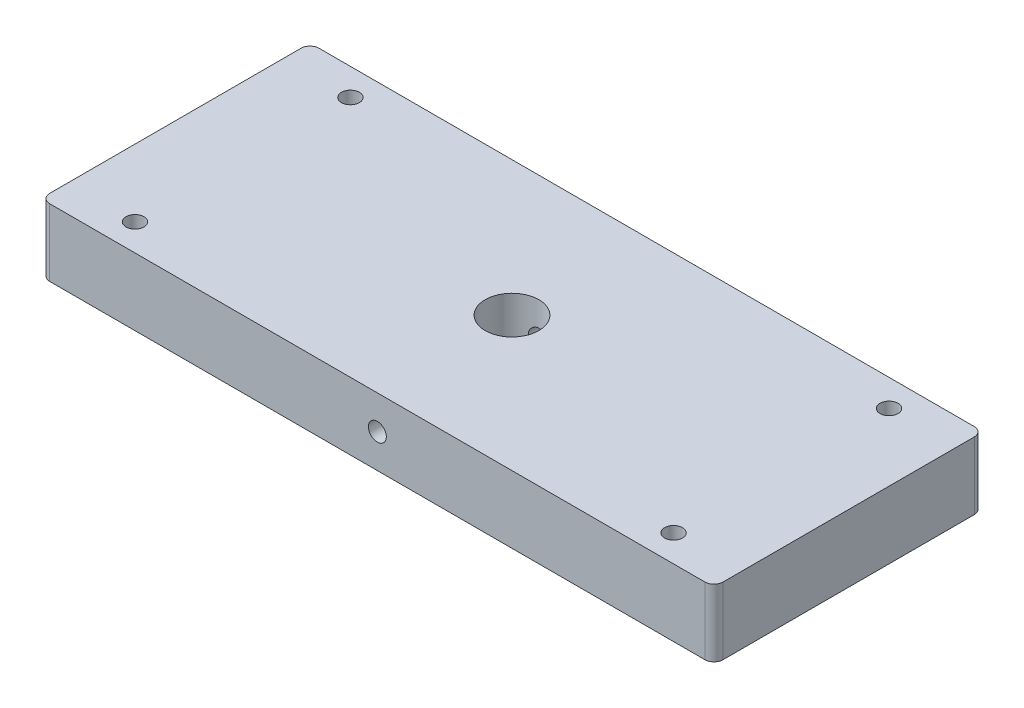
ISO-10303-21;
HEADER;
FILE_DESCRIPTION(('STEP AP214'),'2;1');
FILE_NAME('part.step','',(''),(''),'','','');
FILE_SCHEMA(('AUTOMOTIVE_DESIGN { 1 0 10303 214 1 1 1 1 }'));
ENDSEC;
DATA;
#1=APPLICATION_CONTEXT('core data for automotive mechanical design processes');
#2=APPLICATION_PROTOCOL_DEFINITION('international standard','automotive_design',2000,#1);
#3=PRODUCT_CONTEXT('',#1,'mechanical');
#4=PRODUCT('Part','Part','',(#3));
#5=PRODUCT_RELATED_PRODUCT_CATEGORY('part','',(#4));
#6=PRODUCT_DEFINITION_FORMATION('','',#4);
#7=PRODUCT_DEFINITION_CONTEXT('part definition',#1,'design');
#8=PRODUCT_DEFINITION('design','',#6,#7);
#9=PRODUCT_DEFINITION_SHAPE('','',#8);
#10=(LENGTH_UNIT() NAMED_UNIT(*) SI_UNIT(.MILLI.,.METRE.));
#11=(NAMED_UNIT(*) PLANE_ANGLE_UNIT() SI_UNIT($,.RADIAN.));
#12=(NAMED_UNIT(*) SI_UNIT($,.STERADIAN.) SOLID_ANGLE_UNIT());
#13=UNCERTAINTY_MEASURE_WITH_UNIT(LENGTH_MEASURE(1.E-05),#10,'distance_accuracy_value','');
#14=(GEOMETRIC_REPRESENTATION_CONTEXT(3) GLOBAL_UNCERTAINTY_ASSIGNED_CONTEXT((#13)) GLOBAL_UNIT_ASSIGNED_CONTEXT((#10,
#11,#12)) REPRESENTATION_CONTEXT('',''));
#15=CARTESIAN_POINT('',(0.,0.,0.));
#16=DIRECTION('',(0.,0.,1.));
#17=DIRECTION('',(1.,0.,0.));
#18=AXIS2_PLACEMENT_3D('',#15,#16,#17);
#19=CARTESIAN_POINT('',(73.,7.5,-28.));
#20=DIRECTION('',(0.,-1.,0.));
#21=DIRECTION('',(0.,0.,-1.));
#22=AXIS2_PLACEMENT_3D('',#19,#20,#21);
#23=PLANE('',#22);
#24=CARTESIAN_POINT('',(73.,7.5,-28.));
#25=DIRECTION('',(0.,1.,0.));
#26=DIRECTION('',(0.,0.,-1.));
#27=AXIS2_PLACEMENT_3D('',#24,#25,#26);
#28=CIRCLE('',#27,2.);
#29=CARTESIAN_POINT('',(75.,7.5,-28.));
#30=VERTEX_POINT('',#29);
#31=CARTESIAN_POINT('',(73.,7.5,-30.));
#32=VERTEX_POINT('',#31);
#33=EDGE_CURVE('E171',#30,#32,#28,.T.);
#34=ORIENTED_EDGE('',*,*,#33,.T.);
#35=DIRECTION('',(-1.,0.,0.));
#36=VECTOR('',#35,1.);
#37=CARTESIAN_POINT('',(-73.,7.5,-30.));
#38=LINE('',#37,#36);
#39=CARTESIAN_POINT('',(-73.,7.5,-30.));
#40=VERTEX_POINT('',#39);
#41=EDGE_CURVE('E107',#32,#40,#38,.T.);
#42=ORIENTED_EDGE('',*,*,#41,.T.);
#43=CARTESIAN_POINT('',(-73.,7.5,-28.));
#44=DIRECTION('',(0.,1.,0.));
#45=DIRECTION('',(0.,0.,1.));
#46=AXIS2_PLACEMENT_3D('',#43,#44,#45);
#47=CIRCLE('',#46,2.);
#48=CARTESIAN_POINT('',(-75.,7.5,-28.));
#49=VERTEX_POINT('',#48);
#50=EDGE_CURVE('E268',#40,#49,#47,.T.);
#51=ORIENTED_EDGE('',*,*,#50,.T.);
#52=DIRECTION('',(0.,0.,1.));
#53=VECTOR('',#52,1.);
#54=CARTESIAN_POINT('',(-75.,7.5,-28.));
#55=LINE('',#54,#53);
#56=CARTESIAN_POINT('',(-75.,7.5,28.));
#57=VERTEX_POINT('',#56);
#58=EDGE_CURVE('E275',#49,#57,#55,.T.);
#59=ORIENTED_EDGE('',*,*,#58,.T.);
#60=CARTESIAN_POINT('',(-73.,7.5,28.));
#61=DIRECTION('',(0.,1.,0.));
#62=DIRECTION('',(0.,0.,1.));
#63=AXIS2_PLACEMENT_3D('',#60,#61,#62);
#64=CIRCLE('',#63,2.);
#65=CARTESIAN_POINT('',(-73.,7.5,30.));
#66=VERTEX_POINT('',#65);
#67=EDGE_CURVE('E126',#57,#66,#64,.T.);
#68=ORIENTED_EDGE('',*,*,#67,.T.);
#69=DIRECTION('',(1.,0.,0.));
#70=VECTOR('',#69,1.);
#71=CARTESIAN_POINT('',(-73.,7.5,30.));
#72=LINE('',#71,#70);
#73=CARTESIAN_POINT('',(73.,7.5,30.));
#74=VERTEX_POINT('',#73);
#75=EDGE_CURVE('E120',#66,#74,#72,.T.);
#76=ORIENTED_EDGE('',*,*,#75,.T.);
#77=CARTESIAN_POINT('',(73.,7.5,28.));
#78=DIRECTION('',(0.,1.,0.));
#79=DIRECTION('',(0.,0.,1.));
#80=AXIS2_PLACEMENT_3D('',#77,#78,#79);
#81=CIRCLE('',#80,2.00000000000001);
#82=CARTESIAN_POINT('',(75.,7.5,28.));
#83=VERTEX_POINT('',#82);
#84=EDGE_CURVE('E124',#74,#83,#81,.T.);
#85=ORIENTED_EDGE('',*,*,#84,.T.);
#86=DIRECTION('',(0.,0.,-1.));
#87=VECTOR('',#86,1.);
#88=CARTESIAN_POINT('',(75.,7.5,-28.));
#89=LINE('',#88,#87);
#90=EDGE_CURVE('E64',#83,#30,#89,.T.);
#91=ORIENTED_EDGE('',*,*,#90,.T.);
#92=EDGE_LOOP('',(#34,#42,#51,#59,#68,#76,#85,#91));
#93=FACE_BOUND('',#92,.T.);
#94=CARTESIAN_POINT('',(0.,7.5,0.));
#95=DIRECTION('',(0.,1.,0.));
#96=DIRECTION('',(0.,0.,1.));
#97=AXIS2_PLACEMENT_3D('',#94,#95,#96);
#98=CIRCLE('',#97,5.975);
#99=CARTESIAN_POINT('',(0.,7.5,5.97500000000001));
#100=VERTEX_POINT('',#99);
#101=EDGE_CURVE('E153',#100,#100,#98,.T.);
#102=ORIENTED_EDGE('',*,*,#101,.F.);
#103=EDGE_LOOP('',(#102));
#104=FACE_BOUND('',#103,.T.);
#105=CARTESIAN_POINT('',(-60.,7.5,-24.));
#106=DIRECTION('',(0.,1.,0.));
#107=DIRECTION('',(0.,0.,1.));
#108=AXIS2_PLACEMENT_3D('',#105,#106,#107);
#109=CIRCLE('',#108,2.);
#110=CARTESIAN_POINT('',(-60.,7.5,-22.));
#111=VERTEX_POINT('',#110);
#112=EDGE_CURVE('E289',#111,#111,#109,.T.);
#113=ORIENTED_EDGE('',*,*,#112,.F.);
#114=EDGE_LOOP('',(#113));
#115=FACE_BOUND('',#114,.T.);
#116=CARTESIAN_POINT('',(-60.,7.5,24.));
#117=DIRECTION('',(0.,1.,0.));
#118=DIRECTION('',(0.,0.,1.));
#119=AXIS2_PLACEMENT_3D('',#116,#117,#118);
#120=CIRCLE('',#119,2.);
#121=CARTESIAN_POINT('',(-60.,7.5,26.));
#122=VERTEX_POINT('',#121);
#123=EDGE_CURVE('E297',#122,#122,#120,.T.);
#124=ORIENTED_EDGE('',*,*,#123,.F.);
#125=EDGE_LOOP('',(#124));
#126=FACE_BOUND('',#125,.T.);
#127=CARTESIAN_POINT('',(60.,7.5,24.));
#128=DIRECTION('',(0.,1.,0.));
#129=DIRECTION('',(0.,0.,1.));
#130=AXIS2_PLACEMENT_3D('',#127,#128,#129);
#131=CIRCLE('',#130,2.);
#132=CARTESIAN_POINT('',(60.,7.5,26.));
#133=VERTEX_POINT('',#132);
#134=EDGE_CURVE('E304',#133,#133,#131,.T.);
#135=ORIENTED_EDGE('',*,*,#134,.F.);
#136=EDGE_LOOP('',(#135));
#137=FACE_BOUND('',#136,.T.);
#138=CARTESIAN_POINT('',(60.,7.5,-24.));
#139=DIRECTION('',(0.,1.,0.));
#140=DIRECTION('',(0.,0.,1.));
#141=AXIS2_PLACEMENT_3D('',#138,#139,#140);
#142=CIRCLE('',#141,2.);
#143=CARTESIAN_POINT('',(60.,7.5,-22.));
#144=VERTEX_POINT('',#143);
#145=EDGE_CURVE('E312',#144,#144,#142,.T.);
#146=ORIENTED_EDGE('',*,*,#145,.F.);
#147=EDGE_LOOP('',(#146));
#148=FACE_BOUND('',#147,.T.);
#149=ADVANCED_FACE('F39',(#93,#104,#115,#126,#137,#148),#23,.F.);
#150=CARTESIAN_POINT('',(73.,-7.5,-28.));
#151=DIRECTION('',(0.,-1.,0.));
#152=DIRECTION('',(0.,0.,-1.));
#153=AXIS2_PLACEMENT_3D('',#150,#151,#152);
#154=PLANE('',#153);
#155=CARTESIAN_POINT('',(60.,-7.5,24.));
#156=DIRECTION('',(0.,1.,0.));
#157=DIRECTION('',(0.,0.,1.));
#158=AXIS2_PLACEMENT_3D('',#155,#156,#157);
#159=CIRCLE('',#158,2.);
#160=CARTESIAN_POINT('',(60.,-7.5,26.));
#161=VERTEX_POINT('',#160);
#162=EDGE_CURVE('E308',#161,#161,#159,.T.);
#163=ORIENTED_EDGE('',*,*,#162,.T.);
#164=EDGE_LOOP('',(#163));
#165=FACE_BOUND('',#164,.T.);
#166=CARTESIAN_POINT('',(-60.,-7.5,-24.));
#167=DIRECTION('',(0.,1.,0.));
#168=DIRECTION('',(0.,0.,1.));
#169=AXIS2_PLACEMENT_3D('',#166,#167,#168);
#170=CIRCLE('',#169,2.);
#171=CARTESIAN_POINT('',(-60.,-7.5,-22.));
#172=VERTEX_POINT('',#171);
#173=EDGE_CURVE('E293',#172,#172,#170,.T.);
#174=ORIENTED_EDGE('',*,*,#173,.T.);
#175=EDGE_LOOP('',(#174));
#176=FACE_BOUND('',#175,.T.);
#177=CARTESIAN_POINT('',(73.,-7.5,-28.));
#178=DIRECTION('',(0.,1.,0.));
#179=DIRECTION('',(0.,0.,-1.));
#180=AXIS2_PLACEMENT_3D('',#177,#178,#179);
#181=CIRCLE('',#180,2.);
#182=CARTESIAN_POINT('',(75.,-7.5,-28.));
#183=VERTEX_POINT('',#182);
#184=CARTESIAN_POINT('',(73.,-7.5,-30.));
#185=VERTEX_POINT('',#184);
#186=EDGE_CURVE('E148',#183,#185,#181,.T.);
#187=ORIENTED_EDGE('',*,*,#186,.F.);
#188=DIRECTION('',(0.,0.,-1.));
#189=VECTOR('',#188,1.);
#190=CARTESIAN_POINT('',(75.,-7.5,-28.));
#191=LINE('',#190,#189);
#192=CARTESIAN_POINT('',(75.,-7.5,28.));
#193=VERTEX_POINT('',#192);
#194=EDGE_CURVE('E99',#193,#183,#191,.T.);
#195=ORIENTED_EDGE('',*,*,#194,.F.);
#196=CARTESIAN_POINT('',(73.,-7.5,28.));
#197=DIRECTION('',(0.,1.,0.));
#198=DIRECTION('',(0.,0.,1.));
#199=AXIS2_PLACEMENT_3D('',#196,#197,#198);
#200=CIRCLE('',#199,2.00000000000001);
#201=CARTESIAN_POINT('',(73.,-7.5,30.));
#202=VERTEX_POINT('',#201);
#203=EDGE_CURVE('E93',#202,#193,#200,.T.);
#204=ORIENTED_EDGE('',*,*,#203,.F.);
#205=DIRECTION('',(1.,0.,0.));
#206=VECTOR('',#205,1.);
#207=CARTESIAN_POINT('',(-73.,-7.5,30.));
#208=LINE('',#207,#206);
#209=CARTESIAN_POINT('',(-73.,-7.5,30.));
#210=VERTEX_POINT('',#209);
#211=EDGE_CURVE('E135',#210,#202,#208,.T.);
#212=ORIENTED_EDGE('',*,*,#211,.F.);
#213=CARTESIAN_POINT('',(-73.,-7.5,28.));
#214=DIRECTION('',(0.,1.,0.));
#215=DIRECTION('',(0.,0.,1.));
#216=AXIS2_PLACEMENT_3D('',#213,#214,#215);
#217=CIRCLE('',#216,2.);
#218=CARTESIAN_POINT('',(-75.,-7.5,28.));
#219=VERTEX_POINT('',#218);
#220=EDGE_CURVE('E162',#219,#210,#217,.T.);
#221=ORIENTED_EDGE('',*,*,#220,.F.);
#222=DIRECTION('',(0.,0.,1.));
#223=VECTOR('',#222,1.);
#224=CARTESIAN_POINT('',(-75.,-7.5,-28.));
#225=LINE('',#224,#223);
#226=CARTESIAN_POINT('',(-75.,-7.5,-28.));
#227=VERTEX_POINT('',#226);
#228=EDGE_CURVE('E159',#227,#219,#225,.T.);
#229=ORIENTED_EDGE('',*,*,#228,.F.);
#230=CARTESIAN_POINT('',(-73.,-7.5,-28.));
#231=DIRECTION('',(0.,1.,0.));
#232=DIRECTION('',(0.,0.,1.));
#233=AXIS2_PLACEMENT_3D('',#230,#231,#232);
#234=CIRCLE('',#233,2.);
#235=CARTESIAN_POINT('',(-73.,-7.5,-30.));
#236=VERTEX_POINT('',#235);
#237=EDGE_CURVE('E156',#236,#227,#234,.T.);
#238=ORIENTED_EDGE('',*,*,#237,.F.);
#239=DIRECTION('',(-1.,0.,0.));
#240=VECTOR('',#239,1.);
#241=CARTESIAN_POINT('',(-73.,-7.5,-30.));
#242=LINE('',#241,#240);
#243=EDGE_CURVE('E152',#185,#236,#242,.T.);
#244=ORIENTED_EDGE('',*,*,#243,.F.);
#245=EDGE_LOOP('',(#187,#195,#204,#212,#221,#229,#238,#244));
#246=FACE_BOUND('',#245,.T.);
#247=CARTESIAN_POINT('',(0.,-7.5,0.));
#248=DIRECTION('',(0.,1.,0.));
#249=DIRECTION('',(0.,0.,1.));
#250=AXIS2_PLACEMENT_3D('',#247,#248,#249);
#251=CIRCLE('',#250,5.975);
#252=CARTESIAN_POINT('',(0.,-7.5,5.97500000000001));
#253=VERTEX_POINT('',#252);
#254=EDGE_CURVE('E285',#253,#253,#251,.T.);
#255=ORIENTED_EDGE('',*,*,#254,.T.);
#256=EDGE_LOOP('',(#255));
#257=FACE_BOUND('',#256,.T.);
#258=CARTESIAN_POINT('',(-60.,-7.5,24.));
#259=DIRECTION('',(0.,1.,0.));
#260=DIRECTION('',(0.,0.,1.));
#261=AXIS2_PLACEMENT_3D('',#258,#259,#260);
#262=CIRCLE('',#261,2.);
#263=CARTESIAN_POINT('',(-60.,-7.5,26.));
#264=VERTEX_POINT('',#263);
#265=EDGE_CURVE('E300',#264,#264,#262,.T.);
#266=ORIENTED_EDGE('',*,*,#265,.T.);
#267=EDGE_LOOP('',(#266));
#268=FACE_BOUND('',#267,.T.);
#269=CARTESIAN_POINT('',(60.,-7.5,-24.));
#270=DIRECTION('',(0.,1.,0.));
#271=DIRECTION('',(0.,0.,1.));
#272=AXIS2_PLACEMENT_3D('',#269,#270,#271);
#273=CIRCLE('',#272,2.);
#274=CARTESIAN_POINT('',(60.,-7.5,-22.));
#275=VERTEX_POINT('',#274);
#276=EDGE_CURVE('E316',#275,#275,#273,.T.);
#277=ORIENTED_EDGE('',*,*,#276,.T.);
#278=EDGE_LOOP('',(#277));
#279=FACE_BOUND('',#278,.T.);
#280=ADVANCED_FACE('F228',(#165,#176,#246,#257,#268,#279),#154,.T.);
#281=CARTESIAN_POINT('',(73.,7.5,-28.));
#282=DIRECTION('',(0.,-1.,0.));
#283=DIRECTION('',(0.,0.,-1.));
#284=AXIS2_PLACEMENT_3D('',#281,#282,#283);
#285=CYLINDRICAL_SURFACE('',#284,2.);
#286=ORIENTED_EDGE('',*,*,#186,.T.);
#287=DIRECTION('',(0.,-1.,0.));
#288=VECTOR('',#287,1.);
#289=CARTESIAN_POINT('',(73.,7.5,-30.));
#290=LINE('',#289,#288);
#291=EDGE_CURVE('E11',#32,#185,#290,.T.);
#292=ORIENTED_EDGE('',*,*,#291,.F.);
#293=ORIENTED_EDGE('',*,*,#33,.F.);
#294=DIRECTION('',(0.,-1.,0.));
#295=VECTOR('',#294,1.);
#296=CARTESIAN_POINT('',(75.,7.5,-28.));
#297=LINE('',#296,#295);
#298=EDGE_CURVE('E144',#30,#183,#297,.T.);
#299=ORIENTED_EDGE('',*,*,#298,.T.);
#300=EDGE_LOOP('',(#286,#292,#293,#299));
#301=FACE_BOUND('',#300,.T.);
#302=ADVANCED_FACE('F41',(#301),#285,.T.);
#303=CARTESIAN_POINT('',(-73.,7.5,-30.));
#304=DIRECTION('',(0.,0.,1.));
#305=DIRECTION('',(1.,0.,0.));
#306=AXIS2_PLACEMENT_3D('',#303,#304,#305);
#307=PLANE('',#306);
#308=CARTESIAN_POINT('',(0.,0.,-30.));
#309=DIRECTION('',(0.,0.,1.));
#310=DIRECTION('',(1.,0.,0.));
#311=AXIS2_PLACEMENT_3D('',#308,#309,#310);
#312=CIRCLE('',#311,2.);
#313=CARTESIAN_POINT('',(2.,0.,-30.));
#314=VERTEX_POINT('',#313);
#315=EDGE_CURVE('E194',#314,#314,#312,.T.);
#316=ORIENTED_EDGE('',*,*,#315,.T.);
#317=EDGE_LOOP('',(#316));
#318=FACE_BOUND('',#317,.T.);
#319=ORIENTED_EDGE('',*,*,#243,.T.);
#320=DIRECTION('',(0.,-1.,0.));
#321=VECTOR('',#320,1.);
#322=CARTESIAN_POINT('',(-73.,7.5,-30.));
#323=LINE('',#322,#321);
#324=EDGE_CURVE('E55',#40,#236,#323,.T.);
#325=ORIENTED_EDGE('',*,*,#324,.F.);
#326=ORIENTED_EDGE('',*,*,#41,.F.);
#327=ORIENTED_EDGE('',*,*,#291,.T.);
#328=EDGE_LOOP('',(#319,#325,#326,#327));
#329=FACE_BOUND('',#328,.T.);
#330=ADVANCED_FACE('F252',(#318,#329),#307,.F.);
#331=CARTESIAN_POINT('',(-73.,7.5,-28.));
#332=DIRECTION('',(0.,-1.,0.));
#333=DIRECTION('',(0.,0.,-1.));
#334=AXIS2_PLACEMENT_3D('',#331,#332,#333);
#335=CYLINDRICAL_SURFACE('',#334,2.);
#336=ORIENTED_EDGE('',*,*,#237,.T.);
#337=DIRECTION('',(0.,-1.,0.));
#338=VECTOR('',#337,1.);
#339=CARTESIAN_POINT('',(-75.,7.5,-28.));
#340=LINE('',#339,#338);
#341=EDGE_CURVE('E182',#49,#227,#340,.T.);
#342=ORIENTED_EDGE('',*,*,#341,.F.);
#343=ORIENTED_EDGE('',*,*,#50,.F.);
#344=ORIENTED_EDGE('',*,*,#324,.T.);
#345=EDGE_LOOP('',(#336,#342,#343,#344));
#346=FACE_BOUND('',#345,.T.);
#347=ADVANCED_FACE('F249',(#346),#335,.T.);
#348=CARTESIAN_POINT('',(-75.,7.5,-28.));
#349=DIRECTION('',(1.,0.,0.));
#350=DIRECTION('',(0.,0.,-1.));
#351=AXIS2_PLACEMENT_3D('',#348,#349,#350);
#352=PLANE('',#351);
#353=ORIENTED_EDGE('',*,*,#228,.T.);
#354=DIRECTION('',(0.,-1.,0.));
#355=VECTOR('',#354,1.);
#356=CARTESIAN_POINT('',(-75.,7.5,28.));
#357=LINE('',#356,#355);
#358=EDGE_CURVE('E178',#57,#219,#357,.T.);
#359=ORIENTED_EDGE('',*,*,#358,.F.);
#360=ORIENTED_EDGE('',*,*,#58,.F.);
#361=ORIENTED_EDGE('',*,*,#341,.T.);
#362=EDGE_LOOP('',(#353,#359,#360,#361));
#363=FACE_BOUND('',#362,.T.);
#364=ADVANCED_FACE('F245',(#363),#352,.F.);
#365=CARTESIAN_POINT('',(-73.,7.5,28.));
#366=DIRECTION('',(0.,-1.,0.));
#367=DIRECTION('',(0.,0.,-1.));
#368=AXIS2_PLACEMENT_3D('',#365,#366,#367);
#369=CYLINDRICAL_SURFACE('',#368,2.);
#370=ORIENTED_EDGE('',*,*,#220,.T.);
#371=DIRECTION('',(0.,-1.,0.));
#372=VECTOR('',#371,1.);
#373=CARTESIAN_POINT('',(-73.,7.5,30.));
#374=LINE('',#373,#372);
#375=EDGE_CURVE('E137',#66,#210,#374,.T.);
#376=ORIENTED_EDGE('',*,*,#375,.F.);
#377=ORIENTED_EDGE('',*,*,#67,.F.);
#378=ORIENTED_EDGE('',*,*,#358,.T.);
#379=EDGE_LOOP('',(#370,#376,#377,#378));
#380=FACE_BOUND('',#379,.T.);
#381=ADVANCED_FACE('F241',(#380),#369,.T.);
#382=CARTESIAN_POINT('',(-73.,7.5,30.));
#383=DIRECTION('',(0.,0.,-1.));
#384=DIRECTION('',(-1.,0.,0.));
#385=AXIS2_PLACEMENT_3D('',#382,#383,#384);
#386=PLANE('',#385);
#387=CARTESIAN_POINT('',(0.,0.,30.));
#388=DIRECTION('',(0.,0.,1.));
#389=DIRECTION('',(1.,0.,0.));
#390=AXIS2_PLACEMENT_3D('',#387,#388,#389);
#391=CIRCLE('',#390,2.);
#392=CARTESIAN_POINT('',(2.,0.,30.));
#393=VERTEX_POINT('',#392);
#394=EDGE_CURVE('E323',#393,#393,#391,.T.);
#395=ORIENTED_EDGE('',*,*,#394,.F.);
#396=EDGE_LOOP('',(#395));
#397=FACE_BOUND('',#396,.T.);
#398=ORIENTED_EDGE('',*,*,#211,.T.);
#399=DIRECTION('',(0.,-1.,0.));
#400=VECTOR('',#399,1.);
#401=CARTESIAN_POINT('',(73.,7.5,30.));
#402=LINE('',#401,#400);
#403=EDGE_CURVE('E132',#74,#202,#402,.T.);
#404=ORIENTED_EDGE('',*,*,#403,.F.);
#405=ORIENTED_EDGE('',*,*,#75,.F.);
#406=ORIENTED_EDGE('',*,*,#375,.T.);
#407=EDGE_LOOP('',(#398,#404,#405,#406));
#408=FACE_BOUND('',#407,.T.);
#409=ADVANCED_FACE('F133',(#397,#408),#386,.F.);
#410=CARTESIAN_POINT('',(73.,7.5,28.));
#411=DIRECTION('',(0.,-1.,0.));
#412=DIRECTION('',(0.,0.,-1.));
#413=AXIS2_PLACEMENT_3D('',#410,#411,#412);
#414=CYLINDRICAL_SURFACE('',#413,2.00000000000001);
#415=ORIENTED_EDGE('',*,*,#203,.T.);
#416=DIRECTION('',(0.,-1.,0.));
#417=VECTOR('',#416,1.);
#418=CARTESIAN_POINT('',(75.,7.5,28.));
#419=LINE('',#418,#417);
#420=EDGE_CURVE('E138',#83,#193,#419,.T.);
#421=ORIENTED_EDGE('',*,*,#420,.F.);
#422=ORIENTED_EDGE('',*,*,#84,.F.);
#423=ORIENTED_EDGE('',*,*,#403,.T.);
#424=EDGE_LOOP('',(#415,#421,#422,#423));
#425=FACE_BOUND('',#424,.T.);
#426=ADVANCED_FACE('F140',(#425),#414,.T.);
#427=CARTESIAN_POINT('',(75.,7.5,-28.));
#428=DIRECTION('',(-1.,0.,0.));
#429=DIRECTION('',(0.,0.,1.));
#430=AXIS2_PLACEMENT_3D('',#427,#428,#429);
#431=PLANE('',#430);
#432=ORIENTED_EDGE('',*,*,#194,.T.);
#433=ORIENTED_EDGE('',*,*,#298,.F.);
#434=ORIENTED_EDGE('',*,*,#90,.F.);
#435=ORIENTED_EDGE('',*,*,#420,.T.);
#436=EDGE_LOOP('',(#432,#433,#434,#435));
#437=FACE_BOUND('',#436,.T.);
#438=ADVANCED_FACE('F223',(#437),#431,.F.);
#439=CARTESIAN_POINT('',(0.,7.5,0.));
#440=DIRECTION('',(0.,-1.,0.));
#441=DIRECTION('',(0.,0.,-1.));
#442=AXIS2_PLACEMENT_3D('',#439,#440,#441);
#443=CYLINDRICAL_SURFACE('',#442,5.975);
#444=CARTESIAN_POINT('',(0.,2.,-5.97499999999999));
#445=CARTESIAN_POINT('',(-0.109100813274884,2.00000059896354,-5.9750003724338));
#446=CARTESIAN_POINT('',(-0.218197830002885,1.99104375200792,-5.97198429779646));
#447=CARTESIAN_POINT('',(-0.433176897194453,1.95556377412956,-5.96024981686502));
#448=CARTESIAN_POINT('',(-0.539058639529741,1.92903896514381,-5.95153086584249));
#449=CARTESIAN_POINT('',(-0.744476820137431,1.85943523190862,-5.92933765105528));
#450=CARTESIAN_POINT('',(-0.844023593017146,1.8163841193542,-5.91587137952719));
#451=CARTESIAN_POINT('',(-1.03448354716831,1.71507604988111,-5.88555696328018));
#452=CARTESIAN_POINT('',(-1.12539499811192,1.65681605416766,-5.86870814287023));
#453=CARTESIAN_POINT('',(-1.29917545528331,1.5246096551223,-5.83274331063229));
#454=CARTESIAN_POINT('',(-1.38170162434403,1.45022755550802,-5.81357266246458));
#455=CARTESIAN_POINT('',(-1.53337086821341,1.28881467943789,-5.77542437648222));
#456=CARTESIAN_POINT('',(-1.60251096272538,1.20178109376964,-5.75644678253849));
#457=CARTESIAN_POINT('',(-1.72740941752546,1.01444099185338,-5.72023106450879));
#458=CARTESIAN_POINT('',(-1.78272089322697,0.913822440377365,-5.70305945421818));
#459=CARTESIAN_POINT('',(-1.8754902877492,0.704043735076641,-5.67323128414203));
#460=CARTESIAN_POINT('',(-1.91295370707432,0.594886224920731,-5.66057333361683));
#461=CARTESIAN_POINT('',(-1.96767524087776,0.375028398467926,-5.64178126070682));
#462=CARTESIAN_POINT('',(-1.98557616483407,0.264506285702271,-5.63544023758891));
#463=CARTESIAN_POINT('',(-2.00267409096361,0.0418593493393735,-5.62938820727482));
#464=CARTESIAN_POINT('',(-2.00187693044101,-0.0702649631472946,-5.62967513091753));
#465=CARTESIAN_POINT('',(-1.98210017412321,-0.287439036978317,-5.63666535220946));
#466=CARTESIAN_POINT('',(-1.96396106381363,-0.392576543435622,-5.64307204016887));
#467=CARTESIAN_POINT('',(-1.9113870101616,-0.598219755737712,-5.66109433033176));
#468=CARTESIAN_POINT('',(-1.87695010041656,-0.698724901061138,-5.67271056108107));
#469=CARTESIAN_POINT('',(-1.7922106971008,-0.89415365268584,-5.70005335908901));
#470=CARTESIAN_POINT('',(-1.74166017689717,-0.988960436439102,-5.71584347581665));
#471=CARTESIAN_POINT('',(-1.62630069622426,-1.16901073138383,-5.7497284485762));
#472=CARTESIAN_POINT('',(-1.56148758962884,-1.25425145082299,-5.76782397414385));
#473=CARTESIAN_POINT('',(-1.41541220527446,-1.41747062705215,-5.80544614969133));
#474=CARTESIAN_POINT('',(-1.33346331083791,-1.4948300463213,-5.82499797576023));
#475=CARTESIAN_POINT('',(-1.15751546522779,-1.63487037660952,-5.86249639794598));
#476=CARTESIAN_POINT('',(-1.0635153402702,-1.69754985612629,-5.88044283740948));
#477=CARTESIAN_POINT('',(-0.86481201755234,-1.80695506968283,-5.91294744407533));
#478=CARTESIAN_POINT('',(-0.760010510593378,-1.85351367364004,-5.92746964541324));
#479=CARTESIAN_POINT('',(-0.543460315788158,-1.92814784115666,-5.95122825559354));
#480=CARTESIAN_POINT('',(-0.431714077356982,-1.95622988138405,-5.96046651648936));
#481=CARTESIAN_POINT('',(-0.209686115466093,-1.99201412882851,-5.97230893940714));
#482=CARTESIAN_POINT('',(-0.0995535257638037,-2.00055272866229,-5.97518518142562));
#483=CARTESIAN_POINT('',(0.120593534889892,-1.99939193590181,-5.9747962963955));
#484=CARTESIAN_POINT('',(0.230608022771819,-1.98969565101988,-5.97153221582215));
#485=CARTESIAN_POINT('',(0.444039974974208,-1.95300139776784,-5.95940904167567));
#486=CARTESIAN_POINT('',(0.547556278869396,-1.92651790023294,-5.95071642750179));
#487=CARTESIAN_POINT('',(0.748633870501959,-1.85764529627934,-5.92877813667515));
#488=CARTESIAN_POINT('',(0.84619439579197,-1.81525415833895,-5.91553187850698));
#489=CARTESIAN_POINT('',(1.03546517156792,-1.71452843969373,-5.88539452249207));
#490=CARTESIAN_POINT('',(1.12695270718522,-1.65580215849242,-5.86841636023654));
#491=CARTESIAN_POINT('',(1.29904600477758,-1.52453276944969,-5.83273872197785));
#492=CARTESIAN_POINT('',(1.37964840568976,-1.45198541059164,-5.8140387172959));
#493=CARTESIAN_POINT('',(1.53152918940361,-1.2912005581871,-5.77593790002973));
#494=CARTESIAN_POINT('',(1.60221081616876,-1.20239628776467,-5.75654425518448));
#495=CARTESIAN_POINT('',(1.72774387684645,-1.01377196903023,-5.7201234555775));
#496=CARTESIAN_POINT('',(1.78259514759318,-0.913951807190477,-5.70309632520871));
#497=CARTESIAN_POINT('',(1.87466369293018,-0.7060660448288,-5.67350060566454));
#498=CARTESIAN_POINT('',(1.91191397217894,-0.598016321593866,-5.66092368285891));
#499=CARTESIAN_POINT('',(1.9675200829789,-0.376658713141155,-5.64184108492867));
#500=CARTESIAN_POINT('',(1.98588452107118,-0.263353247663529,-5.6353326444384));
#501=CARTESIAN_POINT('',(2.00252302665274,-0.0410146814933406,-5.62944014042115));
#502=CARTESIAN_POINT('',(2.00178841621071,0.0679357359795869,-5.62970452728682));
#503=CARTESIAN_POINT('',(1.98269261147232,0.284074122170127,-5.63645768263715));
#504=CARTESIAN_POINT('',(1.9643324831172,0.391262197070483,-5.64294607471165));
#505=CARTESIAN_POINT('',(1.91121096958018,0.598771658265601,-5.66115334875372));
#506=CARTESIAN_POINT('',(1.8767732269619,0.699185686507176,-5.67276878232819));
#507=CARTESIAN_POINT('',(1.79273692668093,0.892886935908095,-5.69988241407682));
#508=CARTESIAN_POINT('',(1.74313498609759,0.986172561010127,-5.71538147849544));
#509=CARTESIAN_POINT('',(1.62763571684274,1.16741194089794,-5.74936494922369));
#510=CARTESIAN_POINT('',(1.56111817519713,1.25495134845545,-5.76795060177786));
#511=CARTESIAN_POINT('',(1.41472153581611,1.41794558508448,-5.80559155306819));
#512=CARTESIAN_POINT('',(1.33483864550896,1.49339697211084,-5.82464698379696));
#513=CARTESIAN_POINT('',(1.16019751810557,1.63307273341956,-5.86198235860112));
#514=CARTESIAN_POINT('',(1.06497698067349,1.69673719788853,-5.88020210955702));
#515=CARTESIAN_POINT('',(0.864584412586536,1.80708825919812,-5.91298629909343));
#516=CARTESIAN_POINT('',(0.75941483616462,1.85377902942496,-5.92755163592525));
#517=CARTESIAN_POINT('',(0.546636434984586,1.926995145888,-5.95086372208996));
#518=CARTESIAN_POINT('',(0.439314612899803,1.95428368569864,-5.95982876513122));
#519=CARTESIAN_POINT('',(0.22132659047178,1.99078325984075,-5.97189588846116));
#520=CARTESIAN_POINT('',(0.110661342269977,1.99999939246915,-5.97499962223905));
#521=CARTESIAN_POINT('',(0.,2.,-5.97499999999999));
#522=B_SPLINE_CURVE_WITH_KNOTS('',3,(#444,#445,#446,#447,#448,#449,#450,#451,#452,#453,#454,
#455,#456,#457,#458,#459,#460,#461,#462,#463,#464,#465,#466,#467,#468,#469,#470,#471,#472,#473,
#474,#475,#476,#477,#478,#479,#480,#481,#482,#483,#484,#485,#486,#487,#488,#489,#490,#491,#492,
#493,#494,#495,#496,#497,#498,#499,#500,#501,#502,#503,#504,#505,#506,#507,#508,#509,#510,#511,
#512,#513,#514,#515,#516,#517,#518,#519,#520,#521),.UNSPECIFIED.,.T.,.F.,(4,2,2,2,2,2,2,2,2,2,2,
2,2,2,2,2,2,2,2,2,2,2,2,2,2,2,2,2,2,2,2,2,2,2,2,2,2,2,4),(0.,0.326895182167216,
0.653821593331832,0.980200223348177,1.30664411507914,1.64335422921556,1.98013922303025,
2.3267039050189,2.67316171174657,3.00785688734735,3.34244757676215,3.6616029853937,
3.98079691137723,4.30516268348809,4.62962287341017,4.97117368809431,5.31275779497208,
5.65778403186826,6.00268926073309,6.33253325369512,6.66232103750845,6.98246066800652,
7.30264119659158,7.63128240058703,7.96002485004134,8.30383631778335,8.64765132911415,
8.99081904865289,9.33383031248494,9.65907515692264,9.98430033271534,10.303243733124,
10.6222583373327,10.955289407857,11.2884151405611,11.6346745188574,11.9808487033812,
12.3125132246329,12.6440841685548),.UNSPECIFIED.);
#523=CARTESIAN_POINT('',(0.,2.,-5.97499999999999));
#524=VERTEX_POINT('',#523);
#525=EDGE_CURVE('E43',#524,#524,#522,.T.);
#526=ORIENTED_EDGE('',*,*,#525,.F.);
#527=EDGE_LOOP('',(#526));
#528=FACE_BOUND('',#527,.T.);
#529=CARTESIAN_POINT('',(2.,0.,5.63033080733274));
#530=CARTESIAN_POINT('',(2.00000061060343,-0.108907263927318,5.63033036561841));
#531=CARTESIAN_POINT('',(1.99107434674116,-0.217810689144613,5.6335252187008));
#532=CARTESIAN_POINT('',(1.95572688358639,-0.432389318166673,5.64589232148276));
#533=CARTESIAN_POINT('',(1.92930292416924,-0.538064009912318,5.65506551421506));
#534=CARTESIAN_POINT('',(1.85999365807829,-0.743041542455664,5.67823636422612));
#535=CARTESIAN_POINT('',(1.81714083267502,-0.842356507662563,5.6922244964192));
#536=CARTESIAN_POINT('',(1.71630132117015,-1.03241989191432,5.72343521047041));
#537=CARTESIAN_POINT('',(1.65831125242398,-1.12316639002643,5.7406585150349));
#538=CARTESIAN_POINT('',(1.52639233437297,-1.2970975950379,5.77716107356873));
#539=CARTESIAN_POINT('',(1.45196693012961,-1.37989496453823,5.79649187522022));
#540=CARTESIAN_POINT('',(1.29034952906499,-1.53209755578327,5.83459579682903));
#541=CARTESIAN_POINT('',(1.20315546669728,-1.60150060655199,5.85336882596507));
#542=CARTESIAN_POINT('',(1.01563994790024,-1.72670539430532,5.88883932592405));
#543=CARTESIAN_POINT('',(0.915033252676293,-1.78210080589428,5.9054691169438));
#544=CARTESIAN_POINT('',(0.705277352090609,-1.87502833447016,5.93417165287255));
#545=CARTESIAN_POINT('',(0.596130478942876,-1.91256530868049,5.94624563670676));
#546=CARTESIAN_POINT('',(0.376453990646194,-1.96739548763864,5.9641109940701));
#547=CARTESIAN_POINT('',(0.266107037226717,-1.98535233551813,5.97010780600128));
#548=CARTESIAN_POINT('',(0.0438142077382996,-2.00262319420415,5.97587264050907));
#549=CARTESIAN_POINT('',(-0.0681312452756722,-2.00194204953522,5.97564228169803));
#550=CARTESIAN_POINT('',(-0.285744093275119,-1.9823760994277,5.96911767235368));
#551=CARTESIAN_POINT('',(-0.391484691501481,-1.96421223340946,5.96306358214524));
#552=CARTESIAN_POINT('',(-0.598319646443529,-1.91138931641737,5.94587370774992));
#553=CARTESIAN_POINT('',(-0.699413687078107,-1.87672914510149,5.93473757841985));
#554=CARTESIAN_POINT('',(-0.895656281741224,-1.79147938898523,5.90833017143946));
#555=CARTESIAN_POINT('',(-0.990708737928111,-1.74068557024741,5.89300624894518));
#556=CARTESIAN_POINT('',(-1.17115337231175,-1.62477906636519,5.85981691080275));
#557=CARTESIAN_POINT('',(-1.2565428383845,-1.55966237622341,5.84195078479162));
#558=CARTESIAN_POINT('',(-1.41952485699021,-1.41333060378409,5.8045584474352));
#559=CARTESIAN_POINT('',(-1.49655516343658,-1.33149824573877,5.78499369073047));
#560=CARTESIAN_POINT('',(-1.63598214578741,-1.15591205553017,5.7471227676928));
#561=CARTESIAN_POINT('',(-1.69837652691603,-1.0621563574481,5.72881679904364));
#562=CARTESIAN_POINT('',(-1.80754782502729,-0.863589450437292,5.69532410983273));
#563=CARTESIAN_POINT('',(-1.85408547880308,-0.758637796326448,5.68018640259563));
#564=CARTESIAN_POINT('',(-1.92863613865242,-0.541753366083774,5.65531169624359));
#565=CARTESIAN_POINT('',(-1.95665698653828,-0.429823567181554,5.64557241119496));
#566=CARTESIAN_POINT('',(-1.99222964784415,-0.207610007627495,5.63311522942659));
#567=CARTESIAN_POINT('',(-2.00065390730029,-0.0974826535109742,5.63009832525349));
#568=CARTESIAN_POINT('',(-1.9992670410338,0.122630394460894,5.63059136970844));
#569=CARTESIAN_POINT('',(-1.98945926310595,0.232616110613132,5.63410012008582));
#570=CARTESIAN_POINT('',(-1.95267091062407,0.445339404485063,5.64695085715544));
#571=CARTESIAN_POINT('',(-1.92629875412132,0.548196044371737,5.65608596316315));
#572=CARTESIAN_POINT('',(-1.85786145824128,0.748002817302164,5.67893196792124));
#573=CARTESIAN_POINT('',(-1.81579352214121,0.844951894134429,5.69264368209997));
#574=CARTESIAN_POINT('',(-1.71563309997465,1.03362133558964,5.7236397781676));
#575=CARTESIAN_POINT('',(-1.65707198625661,1.12507603120896,5.74102422619367));
#576=CARTESIAN_POINT('',(-1.52611757065055,1.29717586499223,5.77721367031504));
#577=CARTESIAN_POINT('',(-1.4537201583683,1.37781777882383,5.79601908753601));
#578=CARTESIAN_POINT('',(-1.29297199383036,1.53005246257597,5.83403664361262));
#579=CARTESIAN_POINT('',(-1.20401708310905,1.60101530072499,5.85322415922902));
#580=CARTESIAN_POINT('',(-1.01498995872004,1.72704836282062,5.88894377305905));
#581=CARTESIAN_POINT('',(-0.914918130302467,1.78211913725941,5.90547596324285));
#582=CARTESIAN_POINT('',(-0.706985252269417,1.87430398427893,5.93394674464491));
#583=CARTESIAN_POINT('',(-0.599179745347796,1.91153374596656,5.94591482523142));
#584=CARTESIAN_POINT('',(-0.378357987563396,1.96717995688784,5.964035636393));
#585=CARTESIAN_POINT('',(-0.265343650846402,1.98560326042664,5.97019048562915));
#586=CARTESIAN_POINT('',(-0.0430718141414462,2.00249261012139,5.9758301114841));
#587=CARTESIAN_POINT('',(0.0661100725183125,2.00186263853601,5.97561702087149));
#588=CARTESIAN_POINT('',(0.28273999859329,1.98289627866915,5.96928999544684));
#589=CARTESIAN_POINT('',(0.390188179919567,1.96456134716517,5.9631765461208));
#590=CARTESIAN_POINT('',(0.598573973871391,1.9113065905942,5.94584742153631));
#591=CARTESIAN_POINT('',(0.699588646056731,1.87665904804979,5.93471563510133));
#592=CARTESIAN_POINT('',(0.894409178333807,1.79201522720518,5.90849638449817));
#593=CARTESIAN_POINT('',(0.988213726901705,1.74201616468092,5.893408202852));
#594=CARTESIAN_POINT('',(1.16975044454916,1.62595148825447,5.86013179301945));
#595=CARTESIAN_POINT('',(1.25712765712809,1.55935809598739,5.84184923593321));
#596=CARTESIAN_POINT('',(1.41976177524467,1.41289071103035,5.80447048212945));
#597=CARTESIAN_POINT('',(1.49501478212203,1.33301246317506,5.7853740261808));
#598=CARTESIAN_POINT('',(1.63429220460287,1.15846425256487,5.74761978877291));
#599=CARTESIAN_POINT('',(1.69775450749551,1.06333406990826,5.72900926289865));
#600=CARTESIAN_POINT('',(1.80774808114679,0.86317873956557,5.69526102457765));
#601=CARTESIAN_POINT('',(1.85428359972635,0.758156082762224,5.68012244119067));
#602=CARTESIAN_POINT('',(1.92724330141637,0.545714372499144,5.65577435666162));
#603=CARTESIAN_POINT('',(1.95443686814156,0.438585957458392,5.64634058524366));
#604=CARTESIAN_POINT('',(1.99081173001981,0.22096957851432,5.63362011907902));
#605=CARTESIAN_POINT('',(1.99999938056303,0.110482813966227,5.63033125543731));
#606=CARTESIAN_POINT('',(2.,0.,5.63033080733274));
#607=B_SPLINE_CURVE_WITH_KNOTS('',3,(#529,#530,#531,#532,#533,#534,#535,#536,#537,#538,#539,
#540,#541,#542,#543,#544,#545,#546,#547,#548,#549,#550,#551,#552,#553,#554,#555,#556,#557,#558,
#559,#560,#561,#562,#563,#564,#565,#566,#567,#568,#569,#570,#571,#572,#573,#574,#575,#576,#577,
#578,#579,#580,#581,#582,#583,#584,#585,#586,#587,#588,#589,#590,#591,#592,#593,#594,#595,#596,
#597,#598,#599,#600,#601,#602,#603,#604,#605,#606),.UNSPECIFIED.,.T.,.F.,(4,2,2,2,2,2,2,2,2,2,2,
2,2,2,2,2,2,2,2,2,2,2,2,2,2,2,2,2,2,2,2,2,2,2,2,2,2,2,4),(0.,0.326312579756328,
0.652676645036139,0.978398760792949,1.30419372645775,1.64165958775381,1.9791801002898,
2.32558924573995,2.67190411923009,3.006076462577,3.34016194620822,3.66103582768687,
3.98193150433705,4.30706310795422,4.63228574152717,4.97294076059323,5.31364915552378,
5.65929179153897,6.00478795495521,6.33458110269622,6.66431369929335,6.98259141490274,
7.30092586932934,7.62942123651916,7.95801434301522,8.30257066067426,8.64711504166277,
8.98939395265054,9.33154807019582,9.65749533656386,9.98341578602934,10.3040791791799,
10.6248007637429,10.9574348393984,11.2901756643202,11.6360824111247,11.9819022917363,
12.3130525058313,12.6440858156766),.UNSPECIFIED.);
#608=CARTESIAN_POINT('',(2.,0.,5.63033080733274));
#609=VERTEX_POINT('',#608);
#610=EDGE_CURVE('E188',#609,#609,#607,.T.);
#611=ORIENTED_EDGE('',*,*,#610,.F.);
#612=EDGE_LOOP('',(#611));
#613=FACE_BOUND('',#612,.T.);
#614=ORIENTED_EDGE('',*,*,#101,.T.);
#615=EDGE_LOOP('',(#614));
#616=FACE_BOUND('',#615,.T.);
#617=ORIENTED_EDGE('',*,*,#254,.F.);
#618=EDGE_LOOP('',(#617));
#619=FACE_BOUND('',#618,.T.);
#620=ADVANCED_FACE('F195',(#528,#613,#616,#619),#443,.F.);
#621=CARTESIAN_POINT('',(-60.,7.5,-24.));
#622=DIRECTION('',(0.,-1.,0.));
#623=DIRECTION('',(0.,0.,-1.));
#624=AXIS2_PLACEMENT_3D('',#621,#622,#623);
#625=CYLINDRICAL_SURFACE('',#624,2.);
#626=ORIENTED_EDGE('',*,*,#112,.T.);
#627=EDGE_LOOP('',(#626));
#628=FACE_BOUND('',#627,.T.);
#629=ORIENTED_EDGE('',*,*,#173,.F.);
#630=EDGE_LOOP('',(#629));
#631=FACE_BOUND('',#630,.T.);
#632=ADVANCED_FACE('F216',(#628,#631),#625,.F.);
#633=CARTESIAN_POINT('',(-60.,7.5,24.));
#634=DIRECTION('',(0.,-1.,0.));
#635=DIRECTION('',(0.,0.,-1.));
#636=AXIS2_PLACEMENT_3D('',#633,#634,#635);
#637=CYLINDRICAL_SURFACE('',#636,2.);
#638=ORIENTED_EDGE('',*,*,#123,.T.);
#639=EDGE_LOOP('',(#638));
#640=FACE_BOUND('',#639,.T.);
#641=ORIENTED_EDGE('',*,*,#265,.F.);
#642=EDGE_LOOP('',(#641));
#643=FACE_BOUND('',#642,.T.);
#644=ADVANCED_FACE('F213',(#640,#643),#637,.F.);
#645=CARTESIAN_POINT('',(60.,7.5,24.));
#646=DIRECTION('',(0.,-1.,0.));
#647=DIRECTION('',(0.,0.,-1.));
#648=AXIS2_PLACEMENT_3D('',#645,#646,#647);
#649=CYLINDRICAL_SURFACE('',#648,2.);
#650=ORIENTED_EDGE('',*,*,#134,.T.);
#651=EDGE_LOOP('',(#650));
#652=FACE_BOUND('',#651,.T.);
#653=ORIENTED_EDGE('',*,*,#162,.F.);
#654=EDGE_LOOP('',(#653));
#655=FACE_BOUND('',#654,.T.);
#656=ADVANCED_FACE('F209',(#652,#655),#649,.F.);
#657=CARTESIAN_POINT('',(60.,7.5,-24.));
#658=DIRECTION('',(0.,-1.,0.));
#659=DIRECTION('',(0.,0.,-1.));
#660=AXIS2_PLACEMENT_3D('',#657,#658,#659);
#661=CYLINDRICAL_SURFACE('',#660,2.);
#662=ORIENTED_EDGE('',*,*,#145,.T.);
#663=EDGE_LOOP('',(#662));
#664=FACE_BOUND('',#663,.T.);
#665=ORIENTED_EDGE('',*,*,#276,.F.);
#666=EDGE_LOOP('',(#665));
#667=FACE_BOUND('',#666,.T.);
#668=ADVANCED_FACE('F204',(#664,#667),#661,.F.);
#669=CARTESIAN_POINT('',(0.,0.,-30.));
#670=DIRECTION('',(0.,0.,1.));
#671=DIRECTION('',(1.,0.,0.));
#672=AXIS2_PLACEMENT_3D('',#669,#670,#671);
#673=CYLINDRICAL_SURFACE('',#672,2.);
#674=ORIENTED_EDGE('',*,*,#610,.T.);
#675=EDGE_LOOP('',(#674));
#676=FACE_BOUND('',#675,.T.);
#677=ORIENTED_EDGE('',*,*,#394,.T.);
#678=EDGE_LOOP('',(#677));
#679=FACE_BOUND('',#678,.T.);
#680=ADVANCED_FACE('F199',(#676,#679),#673,.F.);
#681=ORIENTED_EDGE('',*,*,#525,.T.);
#682=EDGE_LOOP('',(#681));
#683=FACE_BOUND('',#682,.T.);
#684=ORIENTED_EDGE('',*,*,#315,.F.);
#685=EDGE_LOOP('',(#684));
#686=FACE_BOUND('',#685,.T.);
#687=ADVANCED_FACE('F203',(#683,#686),#673,.F.);
#688=CLOSED_SHELL('',(#149,#280,#302,#330,#347,#364,#381,#409,#426,#438,#620,#632,#644,#656,
#668,#680,#687));
#689=MANIFOLD_SOLID_BREP('B2',#688);
#690=ADVANCED_BREP_SHAPE_REPRESENTATION('',(#18,#689),#14);
#691=SHAPE_DEFINITION_REPRESENTATION(#9,#690);
ENDSEC;
END-ISO-10303-21;
